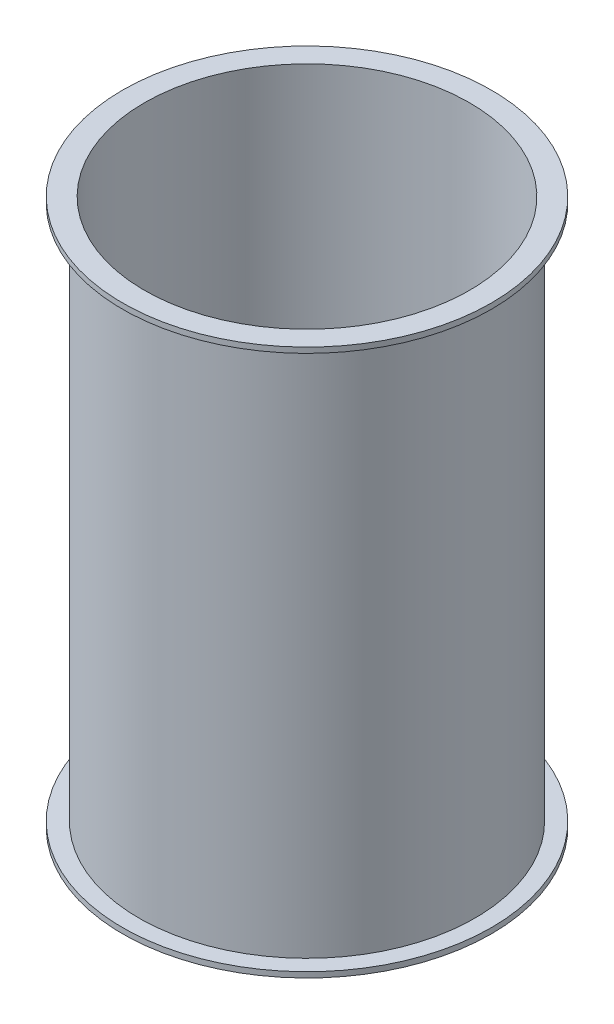
ISO-10303-21;
HEADER;
FILE_DESCRIPTION(('STEP AP214'),'2;1');
FILE_NAME('part.step','',(''),(''),'','','');
FILE_SCHEMA(('AUTOMOTIVE_DESIGN { 1 0 10303 214 1 1 1 1 }'));
ENDSEC;
DATA;
#1=APPLICATION_CONTEXT('core data for automotive mechanical design processes');
#2=APPLICATION_PROTOCOL_DEFINITION('international standard','automotive_design',2000,#1);
#3=PRODUCT_CONTEXT('',#1,'mechanical');
#4=PRODUCT('Part','Part','',(#3));
#5=PRODUCT_RELATED_PRODUCT_CATEGORY('part','',(#4));
#6=PRODUCT_DEFINITION_FORMATION('','',#4);
#7=PRODUCT_DEFINITION_CONTEXT('part definition',#1,'design');
#8=PRODUCT_DEFINITION('design','',#6,#7);
#9=PRODUCT_DEFINITION_SHAPE('','',#8);
#10=(LENGTH_UNIT() NAMED_UNIT(*) SI_UNIT(.MILLI.,.METRE.));
#11=(NAMED_UNIT(*) PLANE_ANGLE_UNIT() SI_UNIT($,.RADIAN.));
#12=(NAMED_UNIT(*) SI_UNIT($,.STERADIAN.) SOLID_ANGLE_UNIT());
#13=UNCERTAINTY_MEASURE_WITH_UNIT(LENGTH_MEASURE(1.E-05),#10,'distance_accuracy_value','');
#14=(GEOMETRIC_REPRESENTATION_CONTEXT(3) GLOBAL_UNCERTAINTY_ASSIGNED_CONTEXT((#13)) GLOBAL_UNIT_ASSIGNED_CONTEXT((#10,
#11,#12)) REPRESENTATION_CONTEXT('',''));
#15=CARTESIAN_POINT('',(0.,0.,0.));
#16=DIRECTION('',(0.,0.,1.));
#17=DIRECTION('',(1.,0.,0.));
#18=AXIS2_PLACEMENT_3D('',#15,#16,#17);
#19=CARTESIAN_POINT('',(-63.5,200.,0.));
#20=DIRECTION('',(0.,1.,0.));
#21=DIRECTION('',(1.,0.,0.));
#22=AXIS2_PLACEMENT_3D('',#19,#20,#21);
#23=PLANE('',#22);
#24=CARTESIAN_POINT('',(0.,200.,0.));
#25=DIRECTION('',(0.,1.,0.));
#26=DIRECTION('',(-1.,0.,0.));
#27=AXIS2_PLACEMENT_3D('',#24,#25,#26);
#28=CIRCLE('',#27,59.5);
#29=CARTESIAN_POINT('',(-59.5,200.,0.));
#30=VERTEX_POINT('',#29);
#31=EDGE_CURVE('E53',#30,#30,#28,.T.);
#32=ORIENTED_EDGE('',*,*,#31,.F.);
#33=EDGE_LOOP('',(#32));
#34=FACE_BOUND('',#33,.T.);
#35=CARTESIAN_POINT('',(0.,200.,0.));
#36=DIRECTION('',(0.,1.,0.));
#37=DIRECTION('',(-1.,0.,0.));
#38=AXIS2_PLACEMENT_3D('',#35,#36,#37);
#39=CIRCLE('',#38,67.5);
#40=CARTESIAN_POINT('',(-67.5,200.,0.));
#41=VERTEX_POINT('',#40);
#42=EDGE_CURVE('E11',#41,#41,#39,.T.);
#43=ORIENTED_EDGE('',*,*,#42,.T.);
#44=EDGE_LOOP('',(#43));
#45=FACE_BOUND('',#44,.T.);
#46=ADVANCED_FACE('F16',(#34,#45),#23,.T.);
#47=CARTESIAN_POINT('',(0.,199.,0.));
#48=DIRECTION('',(0.,1.,0.));
#49=DIRECTION('',(-1.,0.,0.));
#50=AXIS2_PLACEMENT_3D('',#47,#48,#49);
#51=CYLINDRICAL_SURFACE('',#50,67.5);
#52=CARTESIAN_POINT('',(0.,198.,0.));
#53=DIRECTION('',(0.,1.,0.));
#54=DIRECTION('',(-1.,0.,0.));
#55=AXIS2_PLACEMENT_3D('',#52,#53,#54);
#56=CIRCLE('',#55,67.5);
#57=CARTESIAN_POINT('',(-67.5,198.,0.));
#58=VERTEX_POINT('',#57);
#59=EDGE_CURVE('E27',#58,#58,#56,.T.);
#60=ORIENTED_EDGE('',*,*,#59,.T.);
#61=EDGE_LOOP('',(#60));
#62=FACE_BOUND('',#61,.T.);
#63=ORIENTED_EDGE('',*,*,#42,.F.);
#64=EDGE_LOOP('',(#63));
#65=FACE_BOUND('',#64,.T.);
#66=ADVANCED_FACE('F114',(#62,#65),#51,.T.);
#67=CARTESIAN_POINT('',(-64.5,198.,0.));
#68=DIRECTION('',(0.,-1.,0.));
#69=DIRECTION('',(0.,0.,-1.));
#70=AXIS2_PLACEMENT_3D('',#67,#68,#69);
#71=PLANE('',#70);
#72=CARTESIAN_POINT('',(0.,198.,0.));
#73=DIRECTION('',(0.,1.,0.));
#74=DIRECTION('',(-1.,0.,0.));
#75=AXIS2_PLACEMENT_3D('',#72,#73,#74);
#76=CIRCLE('',#75,61.5);
#77=CARTESIAN_POINT('',(-61.5,198.,0.));
#78=VERTEX_POINT('',#77);
#79=EDGE_CURVE('E70',#78,#78,#76,.T.);
#80=ORIENTED_EDGE('',*,*,#79,.T.);
#81=EDGE_LOOP('',(#80));
#82=FACE_BOUND('',#81,.T.);
#83=ORIENTED_EDGE('',*,*,#59,.F.);
#84=EDGE_LOOP('',(#83));
#85=FACE_BOUND('',#84,.T.);
#86=ADVANCED_FACE('F18',(#82,#85),#71,.T.);
#87=CARTESIAN_POINT('',(0.,100.,0.));
#88=DIRECTION('',(0.,1.,0.));
#89=DIRECTION('',(-1.,0.,0.));
#90=AXIS2_PLACEMENT_3D('',#87,#88,#89);
#91=CYLINDRICAL_SURFACE('',#90,61.5);
#92=CARTESIAN_POINT('',(0.,1.99999999999989,0.));
#93=DIRECTION('',(0.,1.,0.));
#94=DIRECTION('',(-1.,0.,0.));
#95=AXIS2_PLACEMENT_3D('',#92,#93,#94);
#96=CIRCLE('',#95,61.5);
#97=CARTESIAN_POINT('',(-61.5,1.99999999999988,0.));
#98=VERTEX_POINT('',#97);
#99=EDGE_CURVE('E74',#98,#98,#96,.T.);
#100=ORIENTED_EDGE('',*,*,#99,.T.);
#101=EDGE_LOOP('',(#100));
#102=FACE_BOUND('',#101,.T.);
#103=ORIENTED_EDGE('',*,*,#79,.F.);
#104=EDGE_LOOP('',(#103));
#105=FACE_BOUND('',#104,.T.);
#106=ADVANCED_FACE('F88',(#102,#105),#91,.T.);
#107=CARTESIAN_POINT('',(-64.5,1.99999999999988,0.));
#108=DIRECTION('',(0.,1.,0.));
#109=DIRECTION('',(1.,0.,0.));
#110=AXIS2_PLACEMENT_3D('',#107,#108,#109);
#111=PLANE('',#110);
#112=ORIENTED_EDGE('',*,*,#99,.F.);
#113=EDGE_LOOP('',(#112));
#114=FACE_BOUND('',#113,.T.);
#115=CARTESIAN_POINT('',(0.,1.99999999999989,0.));
#116=DIRECTION('',(0.,1.,0.));
#117=DIRECTION('',(-1.,0.,0.));
#118=AXIS2_PLACEMENT_3D('',#115,#116,#117);
#119=CIRCLE('',#118,67.5);
#120=CARTESIAN_POINT('',(-67.5,1.99999999999988,0.));
#121=VERTEX_POINT('',#120);
#122=EDGE_CURVE('E77',#121,#121,#119,.T.);
#123=ORIENTED_EDGE('',*,*,#122,.T.);
#124=EDGE_LOOP('',(#123));
#125=FACE_BOUND('',#124,.T.);
#126=ADVANCED_FACE('F93',(#114,#125),#111,.T.);
#127=CARTESIAN_POINT('',(0.,0.999999999999943,0.));
#128=DIRECTION('',(0.,1.,0.));
#129=DIRECTION('',(-1.,0.,0.));
#130=AXIS2_PLACEMENT_3D('',#127,#128,#129);
#131=CYLINDRICAL_SURFACE('',#130,67.5);
#132=CARTESIAN_POINT('',(0.,0.,0.));
#133=DIRECTION('',(0.,1.,0.));
#134=DIRECTION('',(-1.,0.,0.));
#135=AXIS2_PLACEMENT_3D('',#132,#133,#134);
#136=CIRCLE('',#135,67.5);
#137=CARTESIAN_POINT('',(-67.5,0.,0.));
#138=VERTEX_POINT('',#137);
#139=EDGE_CURVE('E20',#138,#138,#136,.T.);
#140=ORIENTED_EDGE('',*,*,#139,.T.);
#141=EDGE_LOOP('',(#140));
#142=FACE_BOUND('',#141,.T.);
#143=ORIENTED_EDGE('',*,*,#122,.F.);
#144=EDGE_LOOP('',(#143));
#145=FACE_BOUND('',#144,.T.);
#146=ADVANCED_FACE('F96',(#142,#145),#131,.T.);
#147=CARTESIAN_POINT('',(-63.5,0.,0.));
#148=DIRECTION('',(0.,-1.,0.));
#149=DIRECTION('',(0.,0.,-1.));
#150=AXIS2_PLACEMENT_3D('',#147,#148,#149);
#151=PLANE('',#150);
#152=CARTESIAN_POINT('',(0.,0.,0.));
#153=DIRECTION('',(0.,1.,0.));
#154=DIRECTION('',(-1.,0.,0.));
#155=AXIS2_PLACEMENT_3D('',#152,#153,#154);
#156=CIRCLE('',#155,59.5);
#157=CARTESIAN_POINT('',(-59.5,0.,0.));
#158=VERTEX_POINT('',#157);
#159=EDGE_CURVE('E59',#158,#158,#156,.T.);
#160=ORIENTED_EDGE('',*,*,#159,.T.);
#161=EDGE_LOOP('',(#160));
#162=FACE_BOUND('',#161,.T.);
#163=ORIENTED_EDGE('',*,*,#139,.F.);
#164=EDGE_LOOP('',(#163));
#165=FACE_BOUND('',#164,.T.);
#166=ADVANCED_FACE('F60',(#162,#165),#151,.T.);
#167=CARTESIAN_POINT('',(0.,100.,0.));
#168=DIRECTION('',(0.,1.,0.));
#169=DIRECTION('',(-1.,0.,0.));
#170=AXIS2_PLACEMENT_3D('',#167,#168,#169);
#171=CYLINDRICAL_SURFACE('',#170,59.5);
#172=ORIENTED_EDGE('',*,*,#31,.T.);
#173=EDGE_LOOP('',(#172));
#174=FACE_BOUND('',#173,.T.);
#175=ORIENTED_EDGE('',*,*,#159,.F.);
#176=EDGE_LOOP('',(#175));
#177=FACE_BOUND('',#176,.T.);
#178=ADVANCED_FACE('F109',(#174,#177),#171,.F.);
#179=CLOSED_SHELL('',(#46,#66,#86,#106,#126,#146,#166,#178));
#180=MANIFOLD_SOLID_BREP('B1',#179);
#181=ADVANCED_BREP_SHAPE_REPRESENTATION('',(#18,#180),#14);
#182=SHAPE_DEFINITION_REPRESENTATION(#9,#181);
ENDSEC;
END-ISO-10303-21;
